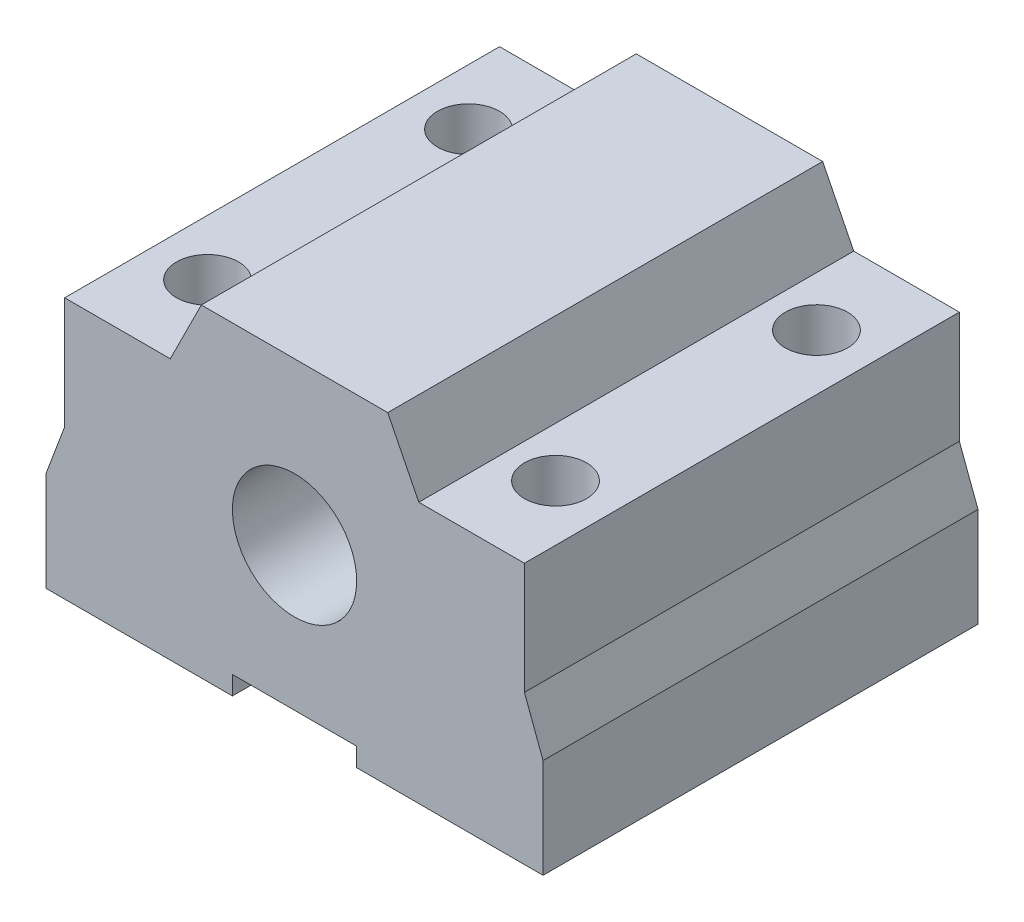
ISO-10303-21;
HEADER;
FILE_DESCRIPTION(('STEP AP214'),'2;1');
FILE_NAME('part.step','',(''),(''),'','','');
FILE_SCHEMA(('AUTOMOTIVE_DESIGN { 1 0 10303 214 1 1 1 1 }'));
ENDSEC;
DATA;
#1=APPLICATION_CONTEXT('core data for automotive mechanical design processes');
#2=APPLICATION_PROTOCOL_DEFINITION('international standard','automotive_design',2000,#1);
#3=PRODUCT_CONTEXT('',#1,'mechanical');
#4=PRODUCT('Part','Part','',(#3));
#5=PRODUCT_RELATED_PRODUCT_CATEGORY('part','',(#4));
#6=PRODUCT_DEFINITION_FORMATION('','',#4);
#7=PRODUCT_DEFINITION_CONTEXT('part definition',#1,'design');
#8=PRODUCT_DEFINITION('design','',#6,#7);
#9=PRODUCT_DEFINITION_SHAPE('','',#8);
#10=(LENGTH_UNIT() NAMED_UNIT(*) SI_UNIT(.MILLI.,.METRE.));
#11=(NAMED_UNIT(*) PLANE_ANGLE_UNIT() SI_UNIT($,.RADIAN.));
#12=(NAMED_UNIT(*) SI_UNIT($,.STERADIAN.) SOLID_ANGLE_UNIT());
#13=UNCERTAINTY_MEASURE_WITH_UNIT(LENGTH_MEASURE(1.E-05),#10,'distance_accuracy_value','');
#14=(GEOMETRIC_REPRESENTATION_CONTEXT(3) GLOBAL_UNCERTAINTY_ASSIGNED_CONTEXT((#13)) GLOBAL_UNIT_ASSIGNED_CONTEXT((#10,
#11,#12)) REPRESENTATION_CONTEXT('',''));
#15=CARTESIAN_POINT('',(0.,0.,0.));
#16=DIRECTION('',(0.,0.,1.));
#17=DIRECTION('',(1.,0.,0.));
#18=AXIS2_PLACEMENT_3D('',#15,#16,#17);
#19=CARTESIAN_POINT('',(0.,0.,35.));
#20=DIRECTION('',(0.,0.,1.));
#21=DIRECTION('',(1.,0.,0.));
#22=AXIS2_PLACEMENT_3D('',#19,#20,#21);
#23=PLANE('',#22);
#24=DIRECTION('',(0.,-1.,0.));
#25=VECTOR('',#24,1.);
#26=CARTESIAN_POINT('',(-18.5,21.,35.));
#27=LINE('',#26,#25);
#28=CARTESIAN_POINT('',(-18.5,21.,35.));
#29=VERTEX_POINT('',#28);
#30=CARTESIAN_POINT('',(-18.5,12.,35.));
#31=VERTEX_POINT('',#30);
#32=EDGE_CURVE('E215',#29,#31,#27,.T.);
#33=ORIENTED_EDGE('',*,*,#32,.T.);
#34=DIRECTION('',(-0.351123441588392,-0.936329177569045,0.));
#35=VECTOR('',#34,1.);
#36=CARTESIAN_POINT('',(-18.5,12.,35.));
#37=LINE('',#36,#35);
#38=CARTESIAN_POINT('',(-20.,8.,35.));
#39=VERTEX_POINT('',#38);
#40=EDGE_CURVE('E123',#31,#39,#37,.T.);
#41=ORIENTED_EDGE('',*,*,#40,.T.);
#42=DIRECTION('',(0.,-1.,0.));
#43=VECTOR('',#42,1.);
#44=CARTESIAN_POINT('',(-20.,8.,35.));
#45=LINE('',#44,#43);
#46=CARTESIAN_POINT('',(-20.,0.,35.));
#47=VERTEX_POINT('',#46);
#48=EDGE_CURVE('E280',#39,#47,#45,.T.);
#49=ORIENTED_EDGE('',*,*,#48,.T.);
#50=DIRECTION('',(1.,0.,0.));
#51=VECTOR('',#50,1.);
#52=CARTESIAN_POINT('',(-20.,0.,35.));
#53=LINE('',#52,#51);
#54=CARTESIAN_POINT('',(-5.,0.,35.));
#55=VERTEX_POINT('',#54);
#56=EDGE_CURVE('E282',#47,#55,#53,.T.);
#57=ORIENTED_EDGE('',*,*,#56,.T.);
#58=DIRECTION('',(0.,1.,0.));
#59=VECTOR('',#58,1.);
#60=CARTESIAN_POINT('',(-5.,1.5,35.));
#61=LINE('',#60,#59);
#62=CARTESIAN_POINT('',(-5.,1.5,35.));
#63=VERTEX_POINT('',#62);
#64=EDGE_CURVE('E284',#55,#63,#61,.T.);
#65=ORIENTED_EDGE('',*,*,#64,.T.);
#66=DIRECTION('',(1.,0.,0.));
#67=VECTOR('',#66,1.);
#68=CARTESIAN_POINT('',(-5.,1.5,35.));
#69=LINE('',#68,#67);
#70=CARTESIAN_POINT('',(5.,1.5,35.));
#71=VERTEX_POINT('',#70);
#72=EDGE_CURVE('E286',#63,#71,#69,.T.);
#73=ORIENTED_EDGE('',*,*,#72,.T.);
#74=DIRECTION('',(0.,-1.,0.));
#75=VECTOR('',#74,1.);
#76=CARTESIAN_POINT('',(5.,1.5,35.));
#77=LINE('',#76,#75);
#78=CARTESIAN_POINT('',(5.,0.,35.));
#79=VERTEX_POINT('',#78);
#80=EDGE_CURVE('E288',#71,#79,#77,.T.);
#81=ORIENTED_EDGE('',*,*,#80,.T.);
#82=DIRECTION('',(1.,0.,0.));
#83=VECTOR('',#82,1.);
#84=CARTESIAN_POINT('',(5.,0.,35.));
#85=LINE('',#84,#83);
#86=CARTESIAN_POINT('',(20.,0.,35.));
#87=VERTEX_POINT('',#86);
#88=EDGE_CURVE('E290',#79,#87,#85,.T.);
#89=ORIENTED_EDGE('',*,*,#88,.T.);
#90=DIRECTION('',(0.,1.,0.));
#91=VECTOR('',#90,1.);
#92=CARTESIAN_POINT('',(20.,8.,35.));
#93=LINE('',#92,#91);
#94=CARTESIAN_POINT('',(20.,8.,35.));
#95=VERTEX_POINT('',#94);
#96=EDGE_CURVE('E292',#87,#95,#93,.T.);
#97=ORIENTED_EDGE('',*,*,#96,.T.);
#98=DIRECTION('',(-0.351123441588392,0.936329177569045,0.));
#99=VECTOR('',#98,1.);
#100=CARTESIAN_POINT('',(18.5,12.,35.));
#101=LINE('',#100,#99);
#102=CARTESIAN_POINT('',(18.5,12.,35.));
#103=VERTEX_POINT('',#102);
#104=EDGE_CURVE('E294',#95,#103,#101,.T.);
#105=ORIENTED_EDGE('',*,*,#104,.T.);
#106=DIRECTION('',(0.,1.,0.));
#107=VECTOR('',#106,1.);
#108=CARTESIAN_POINT('',(18.5,21.,35.));
#109=LINE('',#108,#107);
#110=CARTESIAN_POINT('',(18.5,21.,35.));
#111=VERTEX_POINT('',#110);
#112=EDGE_CURVE('E296',#103,#111,#109,.T.);
#113=ORIENTED_EDGE('',*,*,#112,.T.);
#114=DIRECTION('',(-1.,0.,0.));
#115=VECTOR('',#114,1.);
#116=CARTESIAN_POINT('',(10.,21.,35.));
#117=LINE('',#116,#115);
#118=CARTESIAN_POINT('',(10.,21.,35.));
#119=VERTEX_POINT('',#118);
#120=EDGE_CURVE('E298',#111,#119,#117,.T.);
#121=ORIENTED_EDGE('',*,*,#120,.T.);
#122=DIRECTION('',(-0.447213595499958,0.894427190999916,0.));
#123=VECTOR('',#122,1.);
#124=CARTESIAN_POINT('',(7.5,26.,35.));
#125=LINE('',#124,#123);
#126=CARTESIAN_POINT('',(7.5,26.,35.));
#127=VERTEX_POINT('',#126);
#128=EDGE_CURVE('E166',#119,#127,#125,.T.);
#129=ORIENTED_EDGE('',*,*,#128,.T.);
#130=DIRECTION('',(-1.,0.,0.));
#131=VECTOR('',#130,1.);
#132=CARTESIAN_POINT('',(-7.5,26.,35.));
#133=LINE('',#132,#131);
#134=CARTESIAN_POINT('',(-7.5,26.,35.));
#135=VERTEX_POINT('',#134);
#136=EDGE_CURVE('E160',#127,#135,#133,.T.);
#137=ORIENTED_EDGE('',*,*,#136,.T.);
#138=DIRECTION('',(-0.447213595499958,-0.894427190999916,0.));
#139=VECTOR('',#138,1.);
#140=CARTESIAN_POINT('',(-7.5,26.,35.));
#141=LINE('',#140,#139);
#142=CARTESIAN_POINT('',(-10.,21.,35.));
#143=VERTEX_POINT('',#142);
#144=EDGE_CURVE('E164',#135,#143,#141,.T.);
#145=ORIENTED_EDGE('',*,*,#144,.T.);
#146=DIRECTION('',(-1.,0.,0.));
#147=VECTOR('',#146,1.);
#148=CARTESIAN_POINT('',(-18.5,21.,35.));
#149=LINE('',#148,#147);
#150=EDGE_CURVE('E56',#143,#29,#149,.T.);
#151=ORIENTED_EDGE('',*,*,#150,.T.);
#152=EDGE_LOOP('',(#33,#41,#49,#57,#65,#73,#81,#89,#97,#105,#113,#121,#129,#137,#145,#151));
#153=FACE_BOUND('',#152,.T.);
#154=CARTESIAN_POINT('',(0.,13.,35.));
#155=DIRECTION('',(0.,0.,1.));
#156=DIRECTION('',(1.,0.,0.));
#157=AXIS2_PLACEMENT_3D('',#154,#155,#156);
#158=CIRCLE('',#157,5.);
#159=CARTESIAN_POINT('',(5.,13.,35.));
#160=VERTEX_POINT('',#159);
#161=EDGE_CURVE('E188',#160,#160,#158,.T.);
#162=ORIENTED_EDGE('',*,*,#161,.F.);
#163=EDGE_LOOP('',(#162));
#164=FACE_BOUND('',#163,.T.);
#165=ADVANCED_FACE('F37',(#153,#164),#23,.T.);
#166=CARTESIAN_POINT('',(0.,0.,0.));
#167=DIRECTION('',(0.,0.,1.));
#168=DIRECTION('',(1.,0.,0.));
#169=AXIS2_PLACEMENT_3D('',#166,#167,#168);
#170=PLANE('',#169);
#171=DIRECTION('',(0.,-1.,0.));
#172=VECTOR('',#171,1.);
#173=CARTESIAN_POINT('',(-18.5,21.,0.));
#174=LINE('',#173,#172);
#175=CARTESIAN_POINT('',(-18.5,21.,0.));
#176=VERTEX_POINT('',#175);
#177=CARTESIAN_POINT('',(-18.5,12.,0.));
#178=VERTEX_POINT('',#177);
#179=EDGE_CURVE('E184',#176,#178,#174,.T.);
#180=ORIENTED_EDGE('',*,*,#179,.F.);
#181=DIRECTION('',(-1.,0.,0.));
#182=VECTOR('',#181,1.);
#183=CARTESIAN_POINT('',(-18.5,21.,0.));
#184=LINE('',#183,#182);
#185=CARTESIAN_POINT('',(-10.,21.,0.));
#186=VERTEX_POINT('',#185);
#187=EDGE_CURVE('E115',#186,#176,#184,.T.);
#188=ORIENTED_EDGE('',*,*,#187,.F.);
#189=DIRECTION('',(-0.447213595499958,-0.894427190999916,0.));
#190=VECTOR('',#189,1.);
#191=CARTESIAN_POINT('',(-7.5,26.,0.));
#192=LINE('',#191,#190);
#193=CARTESIAN_POINT('',(-7.5,26.,0.));
#194=VERTEX_POINT('',#193);
#195=EDGE_CURVE('E109',#194,#186,#192,.T.);
#196=ORIENTED_EDGE('',*,*,#195,.F.);
#197=DIRECTION('',(-1.,0.,0.));
#198=VECTOR('',#197,1.);
#199=CARTESIAN_POINT('',(-7.5,26.,0.));
#200=LINE('',#199,#198);
#201=CARTESIAN_POINT('',(7.5,26.,0.));
#202=VERTEX_POINT('',#201);
#203=EDGE_CURVE('E174',#202,#194,#200,.T.);
#204=ORIENTED_EDGE('',*,*,#203,.F.);
#205=DIRECTION('',(-0.447213595499958,0.894427190999916,0.));
#206=VECTOR('',#205,1.);
#207=CARTESIAN_POINT('',(7.5,26.,0.));
#208=LINE('',#207,#206);
#209=CARTESIAN_POINT('',(10.,21.,0.));
#210=VERTEX_POINT('',#209);
#211=EDGE_CURVE('E210',#210,#202,#208,.T.);
#212=ORIENTED_EDGE('',*,*,#211,.F.);
#213=DIRECTION('',(-1.,0.,0.));
#214=VECTOR('',#213,1.);
#215=CARTESIAN_POINT('',(10.,21.,0.));
#216=LINE('',#215,#214);
#217=CARTESIAN_POINT('',(18.5,21.,0.));
#218=VERTEX_POINT('',#217);
#219=EDGE_CURVE('E208',#218,#210,#216,.T.);
#220=ORIENTED_EDGE('',*,*,#219,.F.);
#221=DIRECTION('',(0.,1.,0.));
#222=VECTOR('',#221,1.);
#223=CARTESIAN_POINT('',(18.5,21.,0.));
#224=LINE('',#223,#222);
#225=CARTESIAN_POINT('',(18.5,12.,0.));
#226=VERTEX_POINT('',#225);
#227=EDGE_CURVE('E206',#226,#218,#224,.T.);
#228=ORIENTED_EDGE('',*,*,#227,.F.);
#229=DIRECTION('',(-0.351123441588392,0.936329177569045,0.));
#230=VECTOR('',#229,1.);
#231=CARTESIAN_POINT('',(18.5,12.,0.));
#232=LINE('',#231,#230);
#233=CARTESIAN_POINT('',(20.,8.,0.));
#234=VERTEX_POINT('',#233);
#235=EDGE_CURVE('E204',#234,#226,#232,.T.);
#236=ORIENTED_EDGE('',*,*,#235,.F.);
#237=DIRECTION('',(0.,1.,0.));
#238=VECTOR('',#237,1.);
#239=CARTESIAN_POINT('',(20.,8.,0.));
#240=LINE('',#239,#238);
#241=CARTESIAN_POINT('',(20.,0.,0.));
#242=VERTEX_POINT('',#241);
#243=EDGE_CURVE('E202',#242,#234,#240,.T.);
#244=ORIENTED_EDGE('',*,*,#243,.F.);
#245=DIRECTION('',(1.,0.,0.));
#246=VECTOR('',#245,1.);
#247=CARTESIAN_POINT('',(5.,0.,0.));
#248=LINE('',#247,#246);
#249=CARTESIAN_POINT('',(5.,0.,0.));
#250=VERTEX_POINT('',#249);
#251=EDGE_CURVE('E200',#250,#242,#248,.T.);
#252=ORIENTED_EDGE('',*,*,#251,.F.);
#253=DIRECTION('',(0.,-1.,0.));
#254=VECTOR('',#253,1.);
#255=CARTESIAN_POINT('',(5.,1.5,0.));
#256=LINE('',#255,#254);
#257=CARTESIAN_POINT('',(5.,1.5,0.));
#258=VERTEX_POINT('',#257);
#259=EDGE_CURVE('E198',#258,#250,#256,.T.);
#260=ORIENTED_EDGE('',*,*,#259,.F.);
#261=DIRECTION('',(1.,0.,0.));
#262=VECTOR('',#261,1.);
#263=CARTESIAN_POINT('',(-5.,1.5,0.));
#264=LINE('',#263,#262);
#265=CARTESIAN_POINT('',(-5.,1.5,0.));
#266=VERTEX_POINT('',#265);
#267=EDGE_CURVE('E196',#266,#258,#264,.T.);
#268=ORIENTED_EDGE('',*,*,#267,.F.);
#269=DIRECTION('',(0.,1.,0.));
#270=VECTOR('',#269,1.);
#271=CARTESIAN_POINT('',(-5.,1.5,0.));
#272=LINE('',#271,#270);
#273=CARTESIAN_POINT('',(-5.,0.,0.));
#274=VERTEX_POINT('',#273);
#275=EDGE_CURVE('E194',#274,#266,#272,.T.);
#276=ORIENTED_EDGE('',*,*,#275,.F.);
#277=DIRECTION('',(1.,0.,0.));
#278=VECTOR('',#277,1.);
#279=CARTESIAN_POINT('',(-20.,0.,0.));
#280=LINE('',#279,#278);
#281=CARTESIAN_POINT('',(-20.,0.,0.));
#282=VERTEX_POINT('',#281);
#283=EDGE_CURVE('E192',#282,#274,#280,.T.);
#284=ORIENTED_EDGE('',*,*,#283,.F.);
#285=DIRECTION('',(0.,-1.,0.));
#286=VECTOR('',#285,1.);
#287=CARTESIAN_POINT('',(-20.,8.,0.));
#288=LINE('',#287,#286);
#289=CARTESIAN_POINT('',(-20.,8.,0.));
#290=VERTEX_POINT('',#289);
#291=EDGE_CURVE('E190',#290,#282,#288,.T.);
#292=ORIENTED_EDGE('',*,*,#291,.F.);
#293=DIRECTION('',(-0.351123441588392,-0.936329177569045,0.));
#294=VECTOR('',#293,1.);
#295=CARTESIAN_POINT('',(-18.5,12.,0.));
#296=LINE('',#295,#294);
#297=EDGE_CURVE('E187',#178,#290,#296,.T.);
#298=ORIENTED_EDGE('',*,*,#297,.F.);
#299=EDGE_LOOP('',(#180,#188,#196,#204,#212,#220,#228,#236,#244,#252,#260,#268,#276,#284,#292,#298));
#300=FACE_BOUND('',#299,.T.);
#301=CARTESIAN_POINT('',(0.,13.,0.));
#302=DIRECTION('',(0.,0.,1.));
#303=DIRECTION('',(1.,0.,0.));
#304=AXIS2_PLACEMENT_3D('',#301,#302,#303);
#305=CIRCLE('',#304,5.);
#306=CARTESIAN_POINT('',(5.,13.,0.));
#307=VERTEX_POINT('',#306);
#308=EDGE_CURVE('E254',#307,#307,#305,.T.);
#309=ORIENTED_EDGE('',*,*,#308,.T.);
#310=EDGE_LOOP('',(#309));
#311=FACE_BOUND('',#310,.T.);
#312=ADVANCED_FACE('F311',(#300,#311),#170,.F.);
#313=CARTESIAN_POINT('',(-18.5,21.,35.));
#314=DIRECTION('',(1.,0.,0.));
#315=DIRECTION('',(0.,0.,-1.));
#316=AXIS2_PLACEMENT_3D('',#313,#314,#315);
#317=PLANE('',#316);
#318=ORIENTED_EDGE('',*,*,#179,.T.);
#319=DIRECTION('',(0.,0.,-1.));
#320=VECTOR('',#319,1.);
#321=CARTESIAN_POINT('',(-18.5,12.,35.));
#322=LINE('',#321,#320);
#323=EDGE_CURVE('E11',#31,#178,#322,.T.);
#324=ORIENTED_EDGE('',*,*,#323,.F.);
#325=ORIENTED_EDGE('',*,*,#32,.F.);
#326=DIRECTION('',(0.,0.,-1.));
#327=VECTOR('',#326,1.);
#328=CARTESIAN_POINT('',(-18.5,21.,35.));
#329=LINE('',#328,#327);
#330=EDGE_CURVE('E180',#29,#176,#329,.T.);
#331=ORIENTED_EDGE('',*,*,#330,.T.);
#332=EDGE_LOOP('',(#318,#324,#325,#331));
#333=FACE_BOUND('',#332,.T.);
#334=ADVANCED_FACE('F39',(#333),#317,.F.);
#335=CARTESIAN_POINT('',(-18.5,12.,35.));
#336=DIRECTION('',(0.936329177569044,-0.351123441588392,0.));
#337=DIRECTION('',(0.351123441588392,0.936329177569045,0.));
#338=AXIS2_PLACEMENT_3D('',#335,#336,#337);
#339=PLANE('',#338);
#340=ORIENTED_EDGE('',*,*,#297,.T.);
#341=DIRECTION('',(0.,0.,-1.));
#342=VECTOR('',#341,1.);
#343=CARTESIAN_POINT('',(-20.,8.,35.));
#344=LINE('',#343,#342);
#345=EDGE_CURVE('E47',#39,#290,#344,.T.);
#346=ORIENTED_EDGE('',*,*,#345,.F.);
#347=ORIENTED_EDGE('',*,*,#40,.F.);
#348=ORIENTED_EDGE('',*,*,#323,.T.);
#349=EDGE_LOOP('',(#340,#346,#347,#348));
#350=FACE_BOUND('',#349,.T.);
#351=ADVANCED_FACE('F395',(#350),#339,.F.);
#352=CARTESIAN_POINT('',(-20.,8.,35.));
#353=DIRECTION('',(1.,0.,0.));
#354=DIRECTION('',(0.,0.,-1.));
#355=AXIS2_PLACEMENT_3D('',#352,#353,#354);
#356=PLANE('',#355);
#357=ORIENTED_EDGE('',*,*,#291,.T.);
#358=DIRECTION('',(0.,0.,-1.));
#359=VECTOR('',#358,1.);
#360=CARTESIAN_POINT('',(-20.,0.,35.));
#361=LINE('',#360,#359);
#362=EDGE_CURVE('E246',#47,#282,#361,.T.);
#363=ORIENTED_EDGE('',*,*,#362,.F.);
#364=ORIENTED_EDGE('',*,*,#48,.F.);
#365=ORIENTED_EDGE('',*,*,#345,.T.);
#366=EDGE_LOOP('',(#357,#363,#364,#365));
#367=FACE_BOUND('',#366,.T.);
#368=ADVANCED_FACE('F369',(#367),#356,.F.);
#369=CARTESIAN_POINT('',(-20.,0.,35.));
#370=DIRECTION('',(0.,1.,0.));
#371=DIRECTION('',(0.,0.,1.));
#372=AXIS2_PLACEMENT_3D('',#369,#370,#371);
#373=PLANE('',#372);
#374=CARTESIAN_POINT('',(-14.,0.,7.));
#375=DIRECTION('',(0.,-1.,0.));
#376=DIRECTION('',(0.,0.,-1.));
#377=AXIS2_PLACEMENT_3D('',#374,#375,#376);
#378=CIRCLE('',#377,2.5);
#379=CARTESIAN_POINT('',(-14.,0.,4.5));
#380=VERTEX_POINT('',#379);
#381=EDGE_CURVE('E272',#380,#380,#378,.T.);
#382=ORIENTED_EDGE('',*,*,#381,.F.);
#383=EDGE_LOOP('',(#382));
#384=FACE_BOUND('',#383,.T.);
#385=CARTESIAN_POINT('',(-14.,0.,28.));
#386=DIRECTION('',(0.,-1.,0.));
#387=DIRECTION('',(0.,0.,-1.));
#388=AXIS2_PLACEMENT_3D('',#385,#386,#387);
#389=CIRCLE('',#388,2.5);
#390=CARTESIAN_POINT('',(-14.,0.,25.5));
#391=VERTEX_POINT('',#390);
#392=EDGE_CURVE('E255',#391,#391,#389,.T.);
#393=ORIENTED_EDGE('',*,*,#392,.F.);
#394=EDGE_LOOP('',(#393));
#395=FACE_BOUND('',#394,.T.);
#396=ORIENTED_EDGE('',*,*,#283,.T.);
#397=DIRECTION('',(0.,0.,-1.));
#398=VECTOR('',#397,1.);
#399=CARTESIAN_POINT('',(-5.,0.,35.));
#400=LINE('',#399,#398);
#401=EDGE_CURVE('E243',#55,#274,#400,.T.);
#402=ORIENTED_EDGE('',*,*,#401,.F.);
#403=ORIENTED_EDGE('',*,*,#56,.F.);
#404=ORIENTED_EDGE('',*,*,#362,.T.);
#405=EDGE_LOOP('',(#396,#402,#403,#404));
#406=FACE_BOUND('',#405,.T.);
#407=ADVANCED_FACE('F365',(#384,#395,#406),#373,.F.);
#408=CARTESIAN_POINT('',(-5.,1.5,35.));
#409=DIRECTION('',(-1.,0.,0.));
#410=DIRECTION('',(0.,-1.,0.));
#411=AXIS2_PLACEMENT_3D('',#408,#409,#410);
#412=PLANE('',#411);
#413=ORIENTED_EDGE('',*,*,#275,.T.);
#414=DIRECTION('',(0.,0.,-1.));
#415=VECTOR('',#414,1.);
#416=CARTESIAN_POINT('',(-5.,1.5,35.));
#417=LINE('',#416,#415);
#418=EDGE_CURVE('E240',#63,#266,#417,.T.);
#419=ORIENTED_EDGE('',*,*,#418,.F.);
#420=ORIENTED_EDGE('',*,*,#64,.F.);
#421=ORIENTED_EDGE('',*,*,#401,.T.);
#422=EDGE_LOOP('',(#413,#419,#420,#421));
#423=FACE_BOUND('',#422,.T.);
#424=ADVANCED_FACE('F368',(#423),#412,.F.);
#425=CARTESIAN_POINT('',(-5.,1.5,35.));
#426=DIRECTION('',(0.,1.,0.));
#427=DIRECTION('',(0.,0.,1.));
#428=AXIS2_PLACEMENT_3D('',#425,#426,#427);
#429=PLANE('',#428);
#430=ORIENTED_EDGE('',*,*,#267,.T.);
#431=DIRECTION('',(0.,0.,-1.));
#432=VECTOR('',#431,1.);
#433=CARTESIAN_POINT('',(5.,1.5,35.));
#434=LINE('',#433,#432);
#435=EDGE_CURVE('E237',#71,#258,#434,.T.);
#436=ORIENTED_EDGE('',*,*,#435,.F.);
#437=ORIENTED_EDGE('',*,*,#72,.F.);
#438=ORIENTED_EDGE('',*,*,#418,.T.);
#439=EDGE_LOOP('',(#430,#436,#437,#438));
#440=FACE_BOUND('',#439,.T.);
#441=ADVANCED_FACE('F385',(#440),#429,.F.);
#442=CARTESIAN_POINT('',(5.,1.5,35.));
#443=DIRECTION('',(1.,0.,0.));
#444=DIRECTION('',(0.,1.,0.));
#445=AXIS2_PLACEMENT_3D('',#442,#443,#444);
#446=PLANE('',#445);
#447=ORIENTED_EDGE('',*,*,#259,.T.);
#448=DIRECTION('',(0.,0.,-1.));
#449=VECTOR('',#448,1.);
#450=CARTESIAN_POINT('',(5.,0.,35.));
#451=LINE('',#450,#449);
#452=EDGE_CURVE('E234',#79,#250,#451,.T.);
#453=ORIENTED_EDGE('',*,*,#452,.F.);
#454=ORIENTED_EDGE('',*,*,#80,.F.);
#455=ORIENTED_EDGE('',*,*,#435,.T.);
#456=EDGE_LOOP('',(#447,#453,#454,#455));
#457=FACE_BOUND('',#456,.T.);
#458=ADVANCED_FACE('F389',(#457),#446,.F.);
#459=CARTESIAN_POINT('',(5.,0.,35.));
#460=DIRECTION('',(0.,1.,0.));
#461=DIRECTION('',(0.,0.,1.));
#462=AXIS2_PLACEMENT_3D('',#459,#460,#461);
#463=PLANE('',#462);
#464=CARTESIAN_POINT('',(14.,0.,28.));
#465=DIRECTION('',(0.,-1.,0.));
#466=DIRECTION('',(0.,0.,-1.));
#467=AXIS2_PLACEMENT_3D('',#464,#465,#466);
#468=CIRCLE('',#467,2.5);
#469=CARTESIAN_POINT('',(14.,0.,25.5));
#470=VERTEX_POINT('',#469);
#471=EDGE_CURVE('E259',#470,#470,#468,.T.);
#472=ORIENTED_EDGE('',*,*,#471,.F.);
#473=EDGE_LOOP('',(#472));
#474=FACE_BOUND('',#473,.T.);
#475=CARTESIAN_POINT('',(14.,0.,7.));
#476=DIRECTION('',(0.,-1.,0.));
#477=DIRECTION('',(0.,0.,-1.));
#478=AXIS2_PLACEMENT_3D('',#475,#476,#477);
#479=CIRCLE('',#478,2.5);
#480=CARTESIAN_POINT('',(14.,0.,4.5));
#481=VERTEX_POINT('',#480);
#482=EDGE_CURVE('E357',#481,#481,#479,.T.);
#483=ORIENTED_EDGE('',*,*,#482,.F.);
#484=EDGE_LOOP('',(#483));
#485=FACE_BOUND('',#484,.T.);
#486=ORIENTED_EDGE('',*,*,#251,.T.);
#487=DIRECTION('',(0.,0.,-1.));
#488=VECTOR('',#487,1.);
#489=CARTESIAN_POINT('',(20.,0.,35.));
#490=LINE('',#489,#488);
#491=EDGE_CURVE('E231',#87,#242,#490,.T.);
#492=ORIENTED_EDGE('',*,*,#491,.F.);
#493=ORIENTED_EDGE('',*,*,#88,.F.);
#494=ORIENTED_EDGE('',*,*,#452,.T.);
#495=EDGE_LOOP('',(#486,#492,#493,#494));
#496=FACE_BOUND('',#495,.T.);
#497=ADVANCED_FACE('F409',(#474,#485,#496),#463,.F.);
#498=CARTESIAN_POINT('',(20.,8.,35.));
#499=DIRECTION('',(-1.,0.,0.));
#500=DIRECTION('',(0.,0.,1.));
#501=AXIS2_PLACEMENT_3D('',#498,#499,#500);
#502=PLANE('',#501);
#503=ORIENTED_EDGE('',*,*,#243,.T.);
#504=DIRECTION('',(0.,0.,-1.));
#505=VECTOR('',#504,1.);
#506=CARTESIAN_POINT('',(20.,8.,35.));
#507=LINE('',#506,#505);
#508=EDGE_CURVE('E228',#95,#234,#507,.T.);
#509=ORIENTED_EDGE('',*,*,#508,.F.);
#510=ORIENTED_EDGE('',*,*,#96,.F.);
#511=ORIENTED_EDGE('',*,*,#491,.T.);
#512=EDGE_LOOP('',(#503,#509,#510,#511));
#513=FACE_BOUND('',#512,.T.);
#514=ADVANCED_FACE('F412',(#513),#502,.F.);
#515=CARTESIAN_POINT('',(18.5,12.,35.));
#516=DIRECTION('',(-0.936329177569044,-0.351123441588392,0.));
#517=DIRECTION('',(0.351123441588392,-0.936329177569045,0.));
#518=AXIS2_PLACEMENT_3D('',#515,#516,#517);
#519=PLANE('',#518);
#520=ORIENTED_EDGE('',*,*,#235,.T.);
#521=DIRECTION('',(0.,0.,-1.));
#522=VECTOR('',#521,1.);
#523=CARTESIAN_POINT('',(18.5,12.,35.));
#524=LINE('',#523,#522);
#525=EDGE_CURVE('E225',#103,#226,#524,.T.);
#526=ORIENTED_EDGE('',*,*,#525,.F.);
#527=ORIENTED_EDGE('',*,*,#104,.F.);
#528=ORIENTED_EDGE('',*,*,#508,.T.);
#529=EDGE_LOOP('',(#520,#526,#527,#528));
#530=FACE_BOUND('',#529,.T.);
#531=ADVANCED_FACE('F415',(#530),#519,.F.);
#532=CARTESIAN_POINT('',(18.5,21.,35.));
#533=DIRECTION('',(-1.,0.,0.));
#534=DIRECTION('',(0.,0.,1.));
#535=AXIS2_PLACEMENT_3D('',#532,#533,#534);
#536=PLANE('',#535);
#537=ORIENTED_EDGE('',*,*,#227,.T.);
#538=DIRECTION('',(0.,0.,-1.));
#539=VECTOR('',#538,1.);
#540=CARTESIAN_POINT('',(18.5,21.,35.));
#541=LINE('',#540,#539);
#542=EDGE_CURVE('E222',#111,#218,#541,.T.);
#543=ORIENTED_EDGE('',*,*,#542,.F.);
#544=ORIENTED_EDGE('',*,*,#112,.F.);
#545=ORIENTED_EDGE('',*,*,#525,.T.);
#546=EDGE_LOOP('',(#537,#543,#544,#545));
#547=FACE_BOUND('',#546,.T.);
#548=ADVANCED_FACE('F419',(#547),#536,.F.);
#549=CARTESIAN_POINT('',(10.,21.,35.));
#550=DIRECTION('',(0.,-1.,0.));
#551=DIRECTION('',(0.,0.,-1.));
#552=AXIS2_PLACEMENT_3D('',#549,#550,#551);
#553=PLANE('',#552);
#554=CARTESIAN_POINT('',(14.,21.,28.));
#555=DIRECTION('',(0.,-1.,0.));
#556=DIRECTION('',(0.,0.,-1.));
#557=AXIS2_PLACEMENT_3D('',#554,#555,#556);
#558=CIRCLE('',#557,2.5);
#559=CARTESIAN_POINT('',(14.,21.,25.5));
#560=VERTEX_POINT('',#559);
#561=EDGE_CURVE('E41',#560,#560,#558,.T.);
#562=ORIENTED_EDGE('',*,*,#561,.T.);
#563=EDGE_LOOP('',(#562));
#564=FACE_BOUND('',#563,.T.);
#565=CARTESIAN_POINT('',(14.,21.,7.));
#566=DIRECTION('',(0.,-1.,0.));
#567=DIRECTION('',(0.,0.,-1.));
#568=AXIS2_PLACEMENT_3D('',#565,#566,#567);
#569=CIRCLE('',#568,2.5);
#570=CARTESIAN_POINT('',(14.,21.,4.5));
#571=VERTEX_POINT('',#570);
#572=EDGE_CURVE('E258',#571,#571,#569,.T.);
#573=ORIENTED_EDGE('',*,*,#572,.T.);
#574=EDGE_LOOP('',(#573));
#575=FACE_BOUND('',#574,.T.);
#576=ORIENTED_EDGE('',*,*,#219,.T.);
#577=DIRECTION('',(0.,0.,-1.));
#578=VECTOR('',#577,1.);
#579=CARTESIAN_POINT('',(10.,21.,35.));
#580=LINE('',#579,#578);
#581=EDGE_CURVE('E219',#119,#210,#580,.T.);
#582=ORIENTED_EDGE('',*,*,#581,.F.);
#583=ORIENTED_EDGE('',*,*,#120,.F.);
#584=ORIENTED_EDGE('',*,*,#542,.T.);
#585=EDGE_LOOP('',(#576,#582,#583,#584));
#586=FACE_BOUND('',#585,.T.);
#587=ADVANCED_FACE('F304',(#564,#575,#586),#553,.F.);
#588=CARTESIAN_POINT('',(7.5,26.,35.));
#589=DIRECTION('',(-0.894427190999916,-0.447213595499958,0.));
#590=DIRECTION('',(0.447213595499958,-0.894427190999916,0.));
#591=AXIS2_PLACEMENT_3D('',#588,#589,#590);
#592=PLANE('',#591);
#593=ORIENTED_EDGE('',*,*,#211,.T.);
#594=DIRECTION('',(0.,0.,-1.));
#595=VECTOR('',#594,1.);
#596=CARTESIAN_POINT('',(7.5,26.,35.));
#597=LINE('',#596,#595);
#598=EDGE_CURVE('E175',#127,#202,#597,.T.);
#599=ORIENTED_EDGE('',*,*,#598,.F.);
#600=ORIENTED_EDGE('',*,*,#128,.F.);
#601=ORIENTED_EDGE('',*,*,#581,.T.);
#602=EDGE_LOOP('',(#593,#599,#600,#601));
#603=FACE_BOUND('',#602,.T.);
#604=ADVANCED_FACE('F308',(#603),#592,.F.);
#605=CARTESIAN_POINT('',(-7.5,26.,35.));
#606=DIRECTION('',(0.,-1.,0.));
#607=DIRECTION('',(0.,0.,-1.));
#608=AXIS2_PLACEMENT_3D('',#605,#606,#607);
#609=PLANE('',#608);
#610=ORIENTED_EDGE('',*,*,#203,.T.);
#611=DIRECTION('',(0.,0.,-1.));
#612=VECTOR('',#611,1.);
#613=CARTESIAN_POINT('',(-7.5,26.,35.));
#614=LINE('',#613,#612);
#615=EDGE_CURVE('E171',#135,#194,#614,.T.);
#616=ORIENTED_EDGE('',*,*,#615,.F.);
#617=ORIENTED_EDGE('',*,*,#136,.F.);
#618=ORIENTED_EDGE('',*,*,#598,.T.);
#619=EDGE_LOOP('',(#610,#616,#617,#618));
#620=FACE_BOUND('',#619,.T.);
#621=ADVANCED_FACE('F172',(#620),#609,.F.);
#622=CARTESIAN_POINT('',(-7.5,26.,35.));
#623=DIRECTION('',(0.894427190999916,-0.447213595499958,0.));
#624=DIRECTION('',(0.447213595499958,0.894427190999916,0.));
#625=AXIS2_PLACEMENT_3D('',#622,#623,#624);
#626=PLANE('',#625);
#627=ORIENTED_EDGE('',*,*,#195,.T.);
#628=DIRECTION('',(0.,0.,-1.));
#629=VECTOR('',#628,1.);
#630=CARTESIAN_POINT('',(-10.,21.,35.));
#631=LINE('',#630,#629);
#632=EDGE_CURVE('E176',#143,#186,#631,.T.);
#633=ORIENTED_EDGE('',*,*,#632,.F.);
#634=ORIENTED_EDGE('',*,*,#144,.F.);
#635=ORIENTED_EDGE('',*,*,#615,.T.);
#636=EDGE_LOOP('',(#627,#633,#634,#635));
#637=FACE_BOUND('',#636,.T.);
#638=ADVANCED_FACE('F178',(#637),#626,.F.);
#639=CARTESIAN_POINT('',(-18.5,21.,35.));
#640=DIRECTION('',(0.,-1.,0.));
#641=DIRECTION('',(0.,0.,-1.));
#642=AXIS2_PLACEMENT_3D('',#639,#640,#641);
#643=PLANE('',#642);
#644=CARTESIAN_POINT('',(-14.,21.,7.));
#645=DIRECTION('',(0.,-1.,0.));
#646=DIRECTION('',(0.,0.,-1.));
#647=AXIS2_PLACEMENT_3D('',#644,#645,#646);
#648=CIRCLE('',#647,2.5);
#649=CARTESIAN_POINT('',(-14.,21.,4.5));
#650=VERTEX_POINT('',#649);
#651=EDGE_CURVE('E256',#650,#650,#648,.T.);
#652=ORIENTED_EDGE('',*,*,#651,.T.);
#653=EDGE_LOOP('',(#652));
#654=FACE_BOUND('',#653,.T.);
#655=CARTESIAN_POINT('',(-14.,21.,28.));
#656=DIRECTION('',(0.,-1.,0.));
#657=DIRECTION('',(0.,0.,-1.));
#658=AXIS2_PLACEMENT_3D('',#655,#656,#657);
#659=CIRCLE('',#658,2.5);
#660=CARTESIAN_POINT('',(-14.,21.,25.5));
#661=VERTEX_POINT('',#660);
#662=EDGE_CURVE('E251',#661,#661,#659,.T.);
#663=ORIENTED_EDGE('',*,*,#662,.T.);
#664=EDGE_LOOP('',(#663));
#665=FACE_BOUND('',#664,.T.);
#666=ORIENTED_EDGE('',*,*,#187,.T.);
#667=ORIENTED_EDGE('',*,*,#330,.F.);
#668=ORIENTED_EDGE('',*,*,#150,.F.);
#669=ORIENTED_EDGE('',*,*,#632,.T.);
#670=EDGE_LOOP('',(#666,#667,#668,#669));
#671=FACE_BOUND('',#670,.T.);
#672=ADVANCED_FACE('F317',(#654,#665,#671),#643,.F.);
#673=CARTESIAN_POINT('',(0.,13.,35.));
#674=DIRECTION('',(0.,0.,-1.));
#675=DIRECTION('',(-1.,0.,0.));
#676=AXIS2_PLACEMENT_3D('',#673,#674,#675);
#677=CYLINDRICAL_SURFACE('',#676,5.);
#678=ORIENTED_EDGE('',*,*,#161,.T.);
#679=EDGE_LOOP('',(#678));
#680=FACE_BOUND('',#679,.T.);
#681=ORIENTED_EDGE('',*,*,#308,.F.);
#682=EDGE_LOOP('',(#681));
#683=FACE_BOUND('',#682,.T.);
#684=ADVANCED_FACE('F319',(#680,#683),#677,.F.);
#685=CARTESIAN_POINT('',(-14.,26.,28.));
#686=DIRECTION('',(0.,-1.,0.));
#687=DIRECTION('',(0.,0.,-1.));
#688=AXIS2_PLACEMENT_3D('',#685,#686,#687);
#689=CYLINDRICAL_SURFACE('',#688,2.5);
#690=CARTESIAN_POINT('',(-14.,0.,25.5));
#691=CARTESIAN_POINT('',(-14.,0.21875,25.5));
#692=CARTESIAN_POINT('',(-14.,0.4375,25.5));
#693=CARTESIAN_POINT('',(-14.,0.875000000000001,25.5));
#694=CARTESIAN_POINT('',(-14.,1.09375,25.5));
#695=CARTESIAN_POINT('',(-14.,1.53125,25.5));
#696=CARTESIAN_POINT('',(-14.,1.75,25.5));
#697=CARTESIAN_POINT('',(-14.,2.1875,25.5));
#698=CARTESIAN_POINT('',(-14.,2.40625,25.5));
#699=CARTESIAN_POINT('',(-14.,2.84375,25.5));
#700=CARTESIAN_POINT('',(-14.,3.0625,25.5));
#701=CARTESIAN_POINT('',(-14.,3.5,25.5));
#702=CARTESIAN_POINT('',(-14.,3.71875,25.5));
#703=CARTESIAN_POINT('',(-14.,4.15625,25.5));
#704=CARTESIAN_POINT('',(-14.,4.375,25.5));
#705=CARTESIAN_POINT('',(-14.,4.8125,25.5));
#706=CARTESIAN_POINT('',(-14.,5.03125,25.5));
#707=CARTESIAN_POINT('',(-14.,5.46875,25.5));
#708=CARTESIAN_POINT('',(-14.,5.6875,25.5));
#709=CARTESIAN_POINT('',(-14.,6.125,25.5));
#710=CARTESIAN_POINT('',(-14.,6.34375,25.5));
#711=CARTESIAN_POINT('',(-14.,6.78125,25.5));
#712=CARTESIAN_POINT('',(-14.,7.,25.5));
#713=CARTESIAN_POINT('',(-14.,7.4375,25.5));
#714=CARTESIAN_POINT('',(-14.,7.65625,25.5));
#715=CARTESIAN_POINT('',(-14.,8.09375,25.5));
#716=CARTESIAN_POINT('',(-14.,8.3125,25.5));
#717=CARTESIAN_POINT('',(-14.,8.75,25.5));
#718=CARTESIAN_POINT('',(-14.,8.96875,25.5));
#719=CARTESIAN_POINT('',(-14.,9.40625,25.5));
#720=CARTESIAN_POINT('',(-14.,9.625,25.5));
#721=CARTESIAN_POINT('',(-14.,10.0625,25.5));
#722=CARTESIAN_POINT('',(-14.,10.28125,25.5));
#723=CARTESIAN_POINT('',(-14.,10.71875,25.5));
#724=CARTESIAN_POINT('',(-14.,10.9375,25.5));
#725=CARTESIAN_POINT('',(-14.,11.375,25.5));
#726=CARTESIAN_POINT('',(-14.,11.59375,25.5));
#727=CARTESIAN_POINT('',(-14.,12.03125,25.5));
#728=CARTESIAN_POINT('',(-14.,12.25,25.5));
#729=CARTESIAN_POINT('',(-14.,12.6875,25.5));
#730=CARTESIAN_POINT('',(-14.,12.90625,25.5));
#731=CARTESIAN_POINT('',(-14.,13.34375,25.5));
#732=CARTESIAN_POINT('',(-14.,13.5625,25.5));
#733=CARTESIAN_POINT('',(-14.,14.,25.5));
#734=CARTESIAN_POINT('',(-14.,14.21875,25.5));
#735=CARTESIAN_POINT('',(-14.,14.65625,25.5));
#736=CARTESIAN_POINT('',(-14.,14.875,25.5));
#737=CARTESIAN_POINT('',(-14.,15.3125,25.5));
#738=CARTESIAN_POINT('',(-14.,15.53125,25.5));
#739=CARTESIAN_POINT('',(-14.,15.96875,25.5));
#740=CARTESIAN_POINT('',(-14.,16.1875,25.5));
#741=CARTESIAN_POINT('',(-14.,16.625,25.5));
#742=CARTESIAN_POINT('',(-14.,16.84375,25.5));
#743=CARTESIAN_POINT('',(-14.,17.28125,25.5));
#744=CARTESIAN_POINT('',(-14.,17.5,25.5));
#745=CARTESIAN_POINT('',(-14.,17.9375,25.5));
#746=CARTESIAN_POINT('',(-14.,18.15625,25.5));
#747=CARTESIAN_POINT('',(-14.,18.59375,25.5));
#748=CARTESIAN_POINT('',(-14.,18.8125,25.5));
#749=CARTESIAN_POINT('',(-14.,19.25,25.5));
#750=CARTESIAN_POINT('',(-14.,19.46875,25.5));
#751=CARTESIAN_POINT('',(-14.,19.90625,25.5));
#752=CARTESIAN_POINT('',(-14.,20.125,25.5));
#753=CARTESIAN_POINT('',(-14.,20.5625,25.5));
#754=CARTESIAN_POINT('',(-14.,20.78125,25.5));
#755=CARTESIAN_POINT('',(-14.,21.,25.5));
#756=B_SPLINE_CURVE_WITH_KNOTS('',3,(#690,#691,#692,#693,#694,#695,#696,#697,#698,#699,#700,
#701,#702,#703,#704,#705,#706,#707,#708,#709,#710,#711,#712,#713,#714,#715,#716,#717,#718,#719,
#720,#721,#722,#723,#724,#725,#726,#727,#728,#729,#730,#731,#732,#733,#734,#735,#736,#737,#738,
#739,#740,#741,#742,#743,#744,#745,#746,#747,#748,#749,#750,#751,#752,#753,#754,#755),
.UNSPECIFIED.,.F.,.F.,(4,2,2,2,2,2,2,2,2,2,2,2,2,2,2,2,2,2,2,2,2,2,2,2,2,2,2,2,2,2,2,2,4),(0.,
0.656250000000001,1.3125,1.96875,2.625,3.28125,3.9375,4.59375,5.25,5.90625,6.5625,7.21875,7.875,
8.53125,9.1875,9.84375,10.5,11.15625,11.8125,12.46875,13.125,13.78125,14.4375,15.09375,15.75,
16.40625,17.0625,17.71875,18.375,19.03125,19.6875,20.34375,21.),.UNSPECIFIED.);
#757=EDGE_CURVE('BSEAM326',#391,#661,#756,.T.);
#758=ORIENTED_EDGE('',*,*,#392,.T.);
#759=ORIENTED_EDGE('',*,*,#662,.F.);
#760=ORIENTED_EDGE('',*,*,#757,.T.);
#761=ORIENTED_EDGE('',*,*,#757,.F.);
#762=EDGE_LOOP('',(#758,#760,#759,#761));
#763=FACE_BOUND('',#762,.T.);
#764=ADVANCED_FACE('F326',(#763),#689,.F.);
#765=CARTESIAN_POINT('',(-14.,26.,7.));
#766=DIRECTION('',(0.,-1.,0.));
#767=DIRECTION('',(0.,0.,-1.));
#768=AXIS2_PLACEMENT_3D('',#765,#766,#767);
#769=CYLINDRICAL_SURFACE('',#768,2.5);
#770=CARTESIAN_POINT('',(-14.,0.,4.5));
#771=CARTESIAN_POINT('',(-14.,0.21875,4.5));
#772=CARTESIAN_POINT('',(-14.,0.4375,4.5));
#773=CARTESIAN_POINT('',(-14.,0.875000000000001,4.5));
#774=CARTESIAN_POINT('',(-14.,1.09375,4.5));
#775=CARTESIAN_POINT('',(-14.,1.53125,4.5));
#776=CARTESIAN_POINT('',(-14.,1.75,4.5));
#777=CARTESIAN_POINT('',(-14.,2.1875,4.5));
#778=CARTESIAN_POINT('',(-14.,2.40625,4.5));
#779=CARTESIAN_POINT('',(-14.,2.84375,4.5));
#780=CARTESIAN_POINT('',(-14.,3.0625,4.5));
#781=CARTESIAN_POINT('',(-14.,3.5,4.5));
#782=CARTESIAN_POINT('',(-14.,3.71875,4.5));
#783=CARTESIAN_POINT('',(-14.,4.15625,4.5));
#784=CARTESIAN_POINT('',(-14.,4.375,4.5));
#785=CARTESIAN_POINT('',(-14.,4.8125,4.5));
#786=CARTESIAN_POINT('',(-14.,5.03125,4.5));
#787=CARTESIAN_POINT('',(-14.,5.46875,4.5));
#788=CARTESIAN_POINT('',(-14.,5.6875,4.5));
#789=CARTESIAN_POINT('',(-14.,6.125,4.5));
#790=CARTESIAN_POINT('',(-14.,6.34375,4.5));
#791=CARTESIAN_POINT('',(-14.,6.78125,4.5));
#792=CARTESIAN_POINT('',(-14.,7.,4.5));
#793=CARTESIAN_POINT('',(-14.,7.4375,4.5));
#794=CARTESIAN_POINT('',(-14.,7.65625,4.5));
#795=CARTESIAN_POINT('',(-14.,8.09375,4.5));
#796=CARTESIAN_POINT('',(-14.,8.3125,4.5));
#797=CARTESIAN_POINT('',(-14.,8.75,4.5));
#798=CARTESIAN_POINT('',(-14.,8.96875,4.5));
#799=CARTESIAN_POINT('',(-14.,9.40625,4.5));
#800=CARTESIAN_POINT('',(-14.,9.625,4.5));
#801=CARTESIAN_POINT('',(-14.,10.0625,4.5));
#802=CARTESIAN_POINT('',(-14.,10.28125,4.5));
#803=CARTESIAN_POINT('',(-14.,10.71875,4.5));
#804=CARTESIAN_POINT('',(-14.,10.9375,4.5));
#805=CARTESIAN_POINT('',(-14.,11.375,4.5));
#806=CARTESIAN_POINT('',(-14.,11.59375,4.5));
#807=CARTESIAN_POINT('',(-14.,12.03125,4.5));
#808=CARTESIAN_POINT('',(-14.,12.25,4.5));
#809=CARTESIAN_POINT('',(-14.,12.6875,4.5));
#810=CARTESIAN_POINT('',(-14.,12.90625,4.5));
#811=CARTESIAN_POINT('',(-14.,13.34375,4.5));
#812=CARTESIAN_POINT('',(-14.,13.5625,4.5));
#813=CARTESIAN_POINT('',(-14.,14.,4.5));
#814=CARTESIAN_POINT('',(-14.,14.21875,4.5));
#815=CARTESIAN_POINT('',(-14.,14.65625,4.5));
#816=CARTESIAN_POINT('',(-14.,14.875,4.5));
#817=CARTESIAN_POINT('',(-14.,15.3125,4.5));
#818=CARTESIAN_POINT('',(-14.,15.53125,4.5));
#819=CARTESIAN_POINT('',(-14.,15.96875,4.5));
#820=CARTESIAN_POINT('',(-14.,16.1875,4.5));
#821=CARTESIAN_POINT('',(-14.,16.625,4.5));
#822=CARTESIAN_POINT('',(-14.,16.84375,4.5));
#823=CARTESIAN_POINT('',(-14.,17.28125,4.5));
#824=CARTESIAN_POINT('',(-14.,17.5,4.5));
#825=CARTESIAN_POINT('',(-14.,17.9375,4.5));
#826=CARTESIAN_POINT('',(-14.,18.15625,4.5));
#827=CARTESIAN_POINT('',(-14.,18.59375,4.5));
#828=CARTESIAN_POINT('',(-14.,18.8125,4.5));
#829=CARTESIAN_POINT('',(-14.,19.25,4.5));
#830=CARTESIAN_POINT('',(-14.,19.46875,4.5));
#831=CARTESIAN_POINT('',(-14.,19.90625,4.5));
#832=CARTESIAN_POINT('',(-14.,20.125,4.5));
#833=CARTESIAN_POINT('',(-14.,20.5625,4.5));
#834=CARTESIAN_POINT('',(-14.,20.78125,4.5));
#835=CARTESIAN_POINT('',(-14.,21.,4.5));
#836=B_SPLINE_CURVE_WITH_KNOTS('',3,(#770,#771,#772,#773,#774,#775,#776,#777,#778,#779,#780,
#781,#782,#783,#784,#785,#786,#787,#788,#789,#790,#791,#792,#793,#794,#795,#796,#797,#798,#799,
#800,#801,#802,#803,#804,#805,#806,#807,#808,#809,#810,#811,#812,#813,#814,#815,#816,#817,#818,
#819,#820,#821,#822,#823,#824,#825,#826,#827,#828,#829,#830,#831,#832,#833,#834,#835),
.UNSPECIFIED.,.F.,.F.,(4,2,2,2,2,2,2,2,2,2,2,2,2,2,2,2,2,2,2,2,2,2,2,2,2,2,2,2,2,2,2,2,4),(0.,
0.656250000000001,1.3125,1.96875,2.625,3.28125,3.9375,4.59375,5.25,5.90625,6.5625,7.21875,7.875,
8.53125,9.1875,9.84375,10.5,11.15625,11.8125,12.46875,13.125,13.78125,14.4375,15.09375,15.75,
16.40625,17.0625,17.71875,18.375,19.03125,19.6875,20.34375,21.),.UNSPECIFIED.);
#837=EDGE_CURVE('BSEAM340',#380,#650,#836,.T.);
#838=ORIENTED_EDGE('',*,*,#381,.T.);
#839=ORIENTED_EDGE('',*,*,#651,.F.);
#840=ORIENTED_EDGE('',*,*,#837,.T.);
#841=ORIENTED_EDGE('',*,*,#837,.F.);
#842=EDGE_LOOP('',(#838,#840,#839,#841));
#843=FACE_BOUND('',#842,.T.);
#844=ADVANCED_FACE('F340',(#843),#769,.F.);
#845=CARTESIAN_POINT('',(14.,26.,7.));
#846=DIRECTION('',(0.,-1.,0.));
#847=DIRECTION('',(0.,0.,-1.));
#848=AXIS2_PLACEMENT_3D('',#845,#846,#847);
#849=CYLINDRICAL_SURFACE('',#848,2.5);
#850=CARTESIAN_POINT('',(14.,0.,4.5));
#851=CARTESIAN_POINT('',(14.,0.21875,4.5));
#852=CARTESIAN_POINT('',(14.,0.4375,4.5));
#853=CARTESIAN_POINT('',(14.,0.875000000000001,4.5));
#854=CARTESIAN_POINT('',(14.,1.09375,4.5));
#855=CARTESIAN_POINT('',(14.,1.53125,4.5));
#856=CARTESIAN_POINT('',(14.,1.75,4.5));
#857=CARTESIAN_POINT('',(14.,2.1875,4.5));
#858=CARTESIAN_POINT('',(14.,2.40625,4.5));
#859=CARTESIAN_POINT('',(14.,2.84375,4.5));
#860=CARTESIAN_POINT('',(14.,3.0625,4.5));
#861=CARTESIAN_POINT('',(14.,3.5,4.5));
#862=CARTESIAN_POINT('',(14.,3.71875,4.5));
#863=CARTESIAN_POINT('',(14.,4.15625,4.5));
#864=CARTESIAN_POINT('',(14.,4.375,4.5));
#865=CARTESIAN_POINT('',(14.,4.8125,4.5));
#866=CARTESIAN_POINT('',(14.,5.03125,4.5));
#867=CARTESIAN_POINT('',(14.,5.46875,4.5));
#868=CARTESIAN_POINT('',(14.,5.6875,4.5));
#869=CARTESIAN_POINT('',(14.,6.125,4.5));
#870=CARTESIAN_POINT('',(14.,6.34375,4.5));
#871=CARTESIAN_POINT('',(14.,6.78125,4.5));
#872=CARTESIAN_POINT('',(14.,7.,4.5));
#873=CARTESIAN_POINT('',(14.,7.4375,4.5));
#874=CARTESIAN_POINT('',(14.,7.65625,4.5));
#875=CARTESIAN_POINT('',(14.,8.09375,4.5));
#876=CARTESIAN_POINT('',(14.,8.3125,4.5));
#877=CARTESIAN_POINT('',(14.,8.75,4.5));
#878=CARTESIAN_POINT('',(14.,8.96875,4.5));
#879=CARTESIAN_POINT('',(14.,9.40625,4.5));
#880=CARTESIAN_POINT('',(14.,9.625,4.5));
#881=CARTESIAN_POINT('',(14.,10.0625,4.5));
#882=CARTESIAN_POINT('',(14.,10.28125,4.5));
#883=CARTESIAN_POINT('',(14.,10.71875,4.5));
#884=CARTESIAN_POINT('',(14.,10.9375,4.5));
#885=CARTESIAN_POINT('',(14.,11.375,4.5));
#886=CARTESIAN_POINT('',(14.,11.59375,4.5));
#887=CARTESIAN_POINT('',(14.,12.03125,4.5));
#888=CARTESIAN_POINT('',(14.,12.25,4.5));
#889=CARTESIAN_POINT('',(14.,12.6875,4.5));
#890=CARTESIAN_POINT('',(14.,12.90625,4.5));
#891=CARTESIAN_POINT('',(14.,13.34375,4.5));
#892=CARTESIAN_POINT('',(14.,13.5625,4.5));
#893=CARTESIAN_POINT('',(14.,14.,4.5));
#894=CARTESIAN_POINT('',(14.,14.21875,4.5));
#895=CARTESIAN_POINT('',(14.,14.65625,4.5));
#896=CARTESIAN_POINT('',(14.,14.875,4.5));
#897=CARTESIAN_POINT('',(14.,15.3125,4.5));
#898=CARTESIAN_POINT('',(14.,15.53125,4.5));
#899=CARTESIAN_POINT('',(14.,15.96875,4.5));
#900=CARTESIAN_POINT('',(14.,16.1875,4.5));
#901=CARTESIAN_POINT('',(14.,16.625,4.5));
#902=CARTESIAN_POINT('',(14.,16.84375,4.5));
#903=CARTESIAN_POINT('',(14.,17.28125,4.5));
#904=CARTESIAN_POINT('',(14.,17.5,4.5));
#905=CARTESIAN_POINT('',(14.,17.9375,4.5));
#906=CARTESIAN_POINT('',(14.,18.15625,4.5));
#907=CARTESIAN_POINT('',(14.,18.59375,4.5));
#908=CARTESIAN_POINT('',(14.,18.8125,4.5));
#909=CARTESIAN_POINT('',(14.,19.25,4.5));
#910=CARTESIAN_POINT('',(14.,19.46875,4.5));
#911=CARTESIAN_POINT('',(14.,19.90625,4.5));
#912=CARTESIAN_POINT('',(14.,20.125,4.5));
#913=CARTESIAN_POINT('',(14.,20.5625,4.5));
#914=CARTESIAN_POINT('',(14.,20.78125,4.5));
#915=CARTESIAN_POINT('',(14.,21.,4.5));
#916=B_SPLINE_CURVE_WITH_KNOTS('',3,(#850,#851,#852,#853,#854,#855,#856,#857,#858,#859,#860,
#861,#862,#863,#864,#865,#866,#867,#868,#869,#870,#871,#872,#873,#874,#875,#876,#877,#878,#879,
#880,#881,#882,#883,#884,#885,#886,#887,#888,#889,#890,#891,#892,#893,#894,#895,#896,#897,#898,
#899,#900,#901,#902,#903,#904,#905,#906,#907,#908,#909,#910,#911,#912,#913,#914,#915),
.UNSPECIFIED.,.F.,.F.,(4,2,2,2,2,2,2,2,2,2,2,2,2,2,2,2,2,2,2,2,2,2,2,2,2,2,2,2,2,2,2,2,4),(0.,
0.656250000000001,1.3125,1.96875,2.625,3.28125,3.9375,4.59375,5.25,5.90625,6.5625,7.21875,7.875,
8.53125,9.1875,9.84375,10.5,11.15625,11.8125,12.46875,13.125,13.78125,14.4375,15.09375,15.75,
16.40625,17.0625,17.71875,18.375,19.03125,19.6875,20.34375,21.),.UNSPECIFIED.);
#917=EDGE_CURVE('BSEAM343',#481,#571,#916,.T.);
#918=ORIENTED_EDGE('',*,*,#482,.T.);
#919=ORIENTED_EDGE('',*,*,#572,.F.);
#920=ORIENTED_EDGE('',*,*,#917,.T.);
#921=ORIENTED_EDGE('',*,*,#917,.F.);
#922=EDGE_LOOP('',(#918,#920,#919,#921));
#923=FACE_BOUND('',#922,.T.);
#924=ADVANCED_FACE('F343',(#923),#849,.F.);
#925=CARTESIAN_POINT('',(14.,26.,28.));
#926=DIRECTION('',(0.,-1.,0.));
#927=DIRECTION('',(0.,0.,-1.));
#928=AXIS2_PLACEMENT_3D('',#925,#926,#927);
#929=CYLINDRICAL_SURFACE('',#928,2.5);
#930=CARTESIAN_POINT('',(14.,0.,25.5));
#931=CARTESIAN_POINT('',(14.,0.21875,25.5));
#932=CARTESIAN_POINT('',(14.,0.4375,25.5));
#933=CARTESIAN_POINT('',(14.,0.875000000000001,25.5));
#934=CARTESIAN_POINT('',(14.,1.09375,25.5));
#935=CARTESIAN_POINT('',(14.,1.53125,25.5));
#936=CARTESIAN_POINT('',(14.,1.75,25.5));
#937=CARTESIAN_POINT('',(14.,2.1875,25.5));
#938=CARTESIAN_POINT('',(14.,2.40625,25.5));
#939=CARTESIAN_POINT('',(14.,2.84375,25.5));
#940=CARTESIAN_POINT('',(14.,3.0625,25.5));
#941=CARTESIAN_POINT('',(14.,3.5,25.5));
#942=CARTESIAN_POINT('',(14.,3.71875,25.5));
#943=CARTESIAN_POINT('',(14.,4.15625,25.5));
#944=CARTESIAN_POINT('',(14.,4.375,25.5));
#945=CARTESIAN_POINT('',(14.,4.8125,25.5));
#946=CARTESIAN_POINT('',(14.,5.03125,25.5));
#947=CARTESIAN_POINT('',(14.,5.46875,25.5));
#948=CARTESIAN_POINT('',(14.,5.6875,25.5));
#949=CARTESIAN_POINT('',(14.,6.125,25.5));
#950=CARTESIAN_POINT('',(14.,6.34375,25.5));
#951=CARTESIAN_POINT('',(14.,6.78125,25.5));
#952=CARTESIAN_POINT('',(14.,7.,25.5));
#953=CARTESIAN_POINT('',(14.,7.4375,25.5));
#954=CARTESIAN_POINT('',(14.,7.65625,25.5));
#955=CARTESIAN_POINT('',(14.,8.09375,25.5));
#956=CARTESIAN_POINT('',(14.,8.3125,25.5));
#957=CARTESIAN_POINT('',(14.,8.75,25.5));
#958=CARTESIAN_POINT('',(14.,8.96875,25.5));
#959=CARTESIAN_POINT('',(14.,9.40625,25.5));
#960=CARTESIAN_POINT('',(14.,9.625,25.5));
#961=CARTESIAN_POINT('',(14.,10.0625,25.5));
#962=CARTESIAN_POINT('',(14.,10.28125,25.5));
#963=CARTESIAN_POINT('',(14.,10.71875,25.5));
#964=CARTESIAN_POINT('',(14.,10.9375,25.5));
#965=CARTESIAN_POINT('',(14.,11.375,25.5));
#966=CARTESIAN_POINT('',(14.,11.59375,25.5));
#967=CARTESIAN_POINT('',(14.,12.03125,25.5));
#968=CARTESIAN_POINT('',(14.,12.25,25.5));
#969=CARTESIAN_POINT('',(14.,12.6875,25.5));
#970=CARTESIAN_POINT('',(14.,12.90625,25.5));
#971=CARTESIAN_POINT('',(14.,13.34375,25.5));
#972=CARTESIAN_POINT('',(14.,13.5625,25.5));
#973=CARTESIAN_POINT('',(14.,14.,25.5));
#974=CARTESIAN_POINT('',(14.,14.21875,25.5));
#975=CARTESIAN_POINT('',(14.,14.65625,25.5));
#976=CARTESIAN_POINT('',(14.,14.875,25.5));
#977=CARTESIAN_POINT('',(14.,15.3125,25.5));
#978=CARTESIAN_POINT('',(14.,15.53125,25.5));
#979=CARTESIAN_POINT('',(14.,15.96875,25.5));
#980=CARTESIAN_POINT('',(14.,16.1875,25.5));
#981=CARTESIAN_POINT('',(14.,16.625,25.5));
#982=CARTESIAN_POINT('',(14.,16.84375,25.5));
#983=CARTESIAN_POINT('',(14.,17.28125,25.5));
#984=CARTESIAN_POINT('',(14.,17.5,25.5));
#985=CARTESIAN_POINT('',(14.,17.9375,25.5));
#986=CARTESIAN_POINT('',(14.,18.15625,25.5));
#987=CARTESIAN_POINT('',(14.,18.59375,25.5));
#988=CARTESIAN_POINT('',(14.,18.8125,25.5));
#989=CARTESIAN_POINT('',(14.,19.25,25.5));
#990=CARTESIAN_POINT('',(14.,19.46875,25.5));
#991=CARTESIAN_POINT('',(14.,19.90625,25.5));
#992=CARTESIAN_POINT('',(14.,20.125,25.5));
#993=CARTESIAN_POINT('',(14.,20.5625,25.5));
#994=CARTESIAN_POINT('',(14.,20.78125,25.5));
#995=CARTESIAN_POINT('',(14.,21.,25.5));
#996=B_SPLINE_CURVE_WITH_KNOTS('',3,(#930,#931,#932,#933,#934,#935,#936,#937,#938,#939,#940,
#941,#942,#943,#944,#945,#946,#947,#948,#949,#950,#951,#952,#953,#954,#955,#956,#957,#958,#959,
#960,#961,#962,#963,#964,#965,#966,#967,#968,#969,#970,#971,#972,#973,#974,#975,#976,#977,#978,
#979,#980,#981,#982,#983,#984,#985,#986,#987,#988,#989,#990,#991,#992,#993,#994,#995),
.UNSPECIFIED.,.F.,.F.,(4,2,2,2,2,2,2,2,2,2,2,2,2,2,2,2,2,2,2,2,2,2,2,2,2,2,2,2,2,2,2,2,4),(0.,
0.656250000000001,1.3125,1.96875,2.625,3.28125,3.9375,4.59375,5.25,5.90625,6.5625,7.21875,7.875,
8.53125,9.1875,9.84375,10.5,11.15625,11.8125,12.46875,13.125,13.78125,14.4375,15.09375,15.75,
16.40625,17.0625,17.71875,18.375,19.03125,19.6875,20.34375,21.),.UNSPECIFIED.);
#997=EDGE_CURVE('BSEAM347',#470,#560,#996,.T.);
#998=ORIENTED_EDGE('',*,*,#471,.T.);
#999=ORIENTED_EDGE('',*,*,#561,.F.);
#1000=ORIENTED_EDGE('',*,*,#997,.T.);
#1001=ORIENTED_EDGE('',*,*,#997,.F.);
#1002=EDGE_LOOP('',(#998,#1000,#999,#1001));
#1003=FACE_BOUND('',#1002,.T.);
#1004=ADVANCED_FACE('F347',(#1003),#929,.F.);
#1005=CLOSED_SHELL('',(#165,#312,#334,#351,#368,#407,#424,#441,#458,#497,#514,#531,#548,#587,
#604,#621,#638,#672,#684,#764,#844,#924,#1004));
#1006=MANIFOLD_SOLID_BREP('B2',#1005);
#1007=ADVANCED_BREP_SHAPE_REPRESENTATION('',(#18,#1006),#14);
#1008=SHAPE_DEFINITION_REPRESENTATION(#9,#1007);
ENDSEC;
END-ISO-10303-21;
